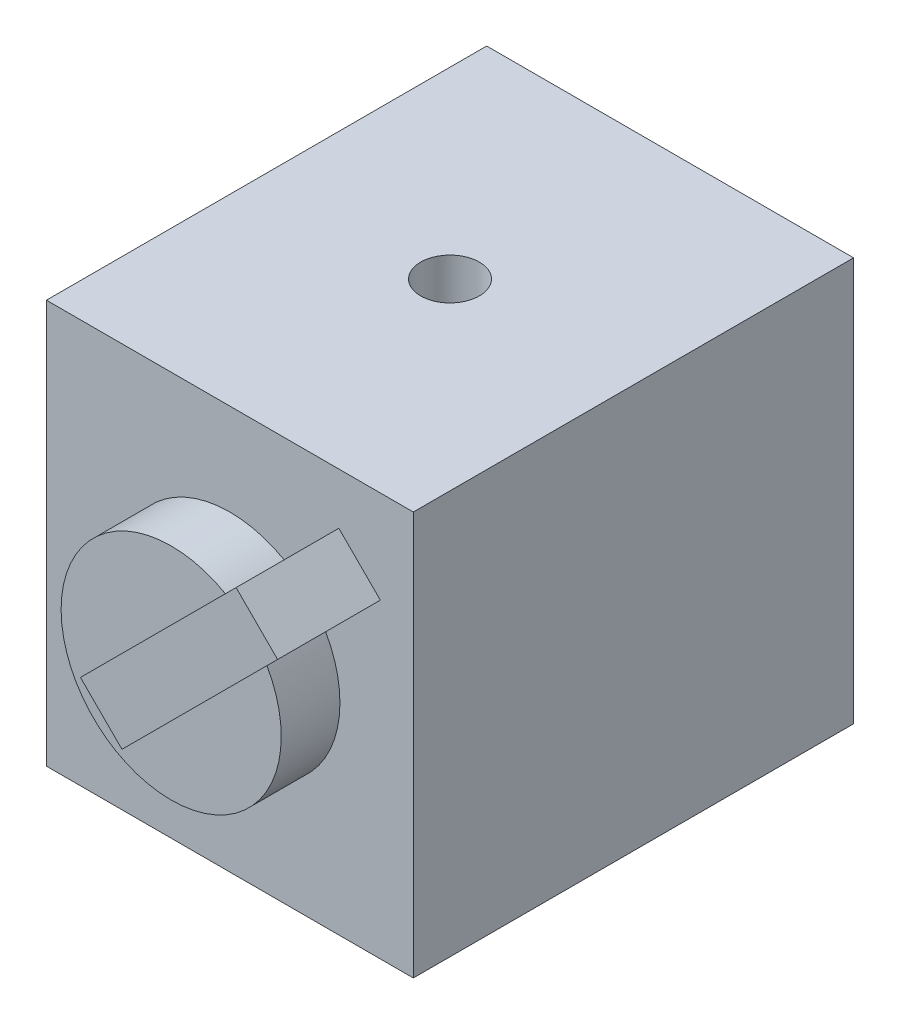
ISO-10303-21;
HEADER;
FILE_DESCRIPTION(('STEP AP214'),'2;1');
FILE_NAME('part.step','',(''),(''),'','','');
FILE_SCHEMA(('AUTOMOTIVE_DESIGN { 1 0 10303 214 1 1 1 1 }'));
ENDSEC;
DATA;
#1=APPLICATION_CONTEXT('core data for automotive mechanical design processes');
#2=APPLICATION_PROTOCOL_DEFINITION('international standard','automotive_design',2000,#1);
#3=PRODUCT_CONTEXT('',#1,'mechanical');
#4=PRODUCT('Part','Part','',(#3));
#5=PRODUCT_RELATED_PRODUCT_CATEGORY('part','',(#4));
#6=PRODUCT_DEFINITION_FORMATION('','',#4);
#7=PRODUCT_DEFINITION_CONTEXT('part definition',#1,'design');
#8=PRODUCT_DEFINITION('design','',#6,#7);
#9=PRODUCT_DEFINITION_SHAPE('','',#8);
#10=(LENGTH_UNIT() NAMED_UNIT(*) SI_UNIT(.MILLI.,.METRE.));
#11=(NAMED_UNIT(*) PLANE_ANGLE_UNIT() SI_UNIT($,.RADIAN.));
#12=(NAMED_UNIT(*) SI_UNIT($,.STERADIAN.) SOLID_ANGLE_UNIT());
#13=UNCERTAINTY_MEASURE_WITH_UNIT(LENGTH_MEASURE(1.E-05),#10,'distance_accuracy_value','');
#14=(GEOMETRIC_REPRESENTATION_CONTEXT(3) GLOBAL_UNCERTAINTY_ASSIGNED_CONTEXT((#13)) GLOBAL_UNIT_ASSIGNED_CONTEXT((#10,
#11,#12)) REPRESENTATION_CONTEXT('',''));
#15=CARTESIAN_POINT('',(0.,0.,0.));
#16=DIRECTION('',(0.,0.,1.));
#17=DIRECTION('',(1.,0.,0.));
#18=AXIS2_PLACEMENT_3D('',#15,#16,#17);
#19=CARTESIAN_POINT('',(-25.,-27.5,30.));
#20=DIRECTION('',(1.,0.,0.));
#21=DIRECTION('',(0.,0.,-1.));
#22=AXIS2_PLACEMENT_3D('',#19,#20,#21);
#23=PLANE('',#22);
#24=DIRECTION('',(0.,-1.,0.));
#25=VECTOR('',#24,1.);
#26=CARTESIAN_POINT('',(-25.,-27.5,-30.));
#27=LINE('',#26,#25);
#28=CARTESIAN_POINT('',(-25.,27.5,-30.));
#29=VERTEX_POINT('',#28);
#30=CARTESIAN_POINT('',(-25.,-27.5,-30.));
#31=VERTEX_POINT('',#30);
#32=EDGE_CURVE('E175',#29,#31,#27,.T.);
#33=ORIENTED_EDGE('',*,*,#32,.T.);
#34=DIRECTION('',(0.,0.,-1.));
#35=VECTOR('',#34,1.);
#36=CARTESIAN_POINT('',(-25.,-27.5,30.));
#37=LINE('',#36,#35);
#38=CARTESIAN_POINT('',(-25.,-27.5,30.));
#39=VERTEX_POINT('',#38);
#40=EDGE_CURVE('E38',#39,#31,#37,.T.);
#41=ORIENTED_EDGE('',*,*,#40,.F.);
#42=DIRECTION('',(0.,-1.,0.));
#43=VECTOR('',#42,1.);
#44=CARTESIAN_POINT('',(-25.,-27.5,30.));
#45=LINE('',#44,#43);
#46=CARTESIAN_POINT('',(-25.,27.5,30.));
#47=VERTEX_POINT('',#46);
#48=EDGE_CURVE('E177',#47,#39,#45,.T.);
#49=ORIENTED_EDGE('',*,*,#48,.F.);
#50=DIRECTION('',(0.,0.,-1.));
#51=VECTOR('',#50,1.);
#52=CARTESIAN_POINT('',(-25.,27.5,30.));
#53=LINE('',#52,#51);
#54=EDGE_CURVE('E183',#47,#29,#53,.T.);
#55=ORIENTED_EDGE('',*,*,#54,.T.);
#56=EDGE_LOOP('',(#33,#41,#49,#55));
#57=FACE_BOUND('',#56,.T.);
#58=ADVANCED_FACE('F35',(#57),#23,.F.);
#59=CARTESIAN_POINT('',(25.,-27.5,30.));
#60=DIRECTION('',(0.,1.,0.));
#61=DIRECTION('',(-1.,0.,0.));
#62=AXIS2_PLACEMENT_3D('',#59,#60,#61);
#63=PLANE('',#62);
#64=DIRECTION('',(1.,0.,0.));
#65=VECTOR('',#64,1.);
#66=CARTESIAN_POINT('',(25.,-27.5,-30.));
#67=LINE('',#66,#65);
#68=CARTESIAN_POINT('',(25.,-27.5,-30.));
#69=VERTEX_POINT('',#68);
#70=EDGE_CURVE('E186',#31,#69,#67,.T.);
#71=ORIENTED_EDGE('',*,*,#70,.T.);
#72=DIRECTION('',(0.,0.,-1.));
#73=VECTOR('',#72,1.);
#74=CARTESIAN_POINT('',(25.,-27.5,30.));
#75=LINE('',#74,#73);
#76=CARTESIAN_POINT('',(25.,-27.5,30.));
#77=VERTEX_POINT('',#76);
#78=EDGE_CURVE('E193',#77,#69,#75,.T.);
#79=ORIENTED_EDGE('',*,*,#78,.F.);
#80=DIRECTION('',(1.,0.,0.));
#81=VECTOR('',#80,1.);
#82=CARTESIAN_POINT('',(25.,-27.5,30.));
#83=LINE('',#82,#81);
#84=EDGE_CURVE('E88',#39,#77,#83,.T.);
#85=ORIENTED_EDGE('',*,*,#84,.F.);
#86=ORIENTED_EDGE('',*,*,#40,.T.);
#87=EDGE_LOOP('',(#71,#79,#85,#86));
#88=FACE_BOUND('',#87,.T.);
#89=ADVANCED_FACE('F199',(#88),#63,.F.);
#90=CARTESIAN_POINT('',(25.,-27.5,30.));
#91=DIRECTION('',(-1.,0.,0.));
#92=DIRECTION('',(0.,0.,1.));
#93=AXIS2_PLACEMENT_3D('',#90,#91,#92);
#94=PLANE('',#93);
#95=DIRECTION('',(0.,1.,0.));
#96=VECTOR('',#95,1.);
#97=CARTESIAN_POINT('',(25.,-27.5,-30.));
#98=LINE('',#97,#96);
#99=CARTESIAN_POINT('',(25.,27.5,-30.));
#100=VERTEX_POINT('',#99);
#101=EDGE_CURVE('E188',#69,#100,#98,.T.);
#102=ORIENTED_EDGE('',*,*,#101,.T.);
#103=DIRECTION('',(0.,0.,-1.));
#104=VECTOR('',#103,1.);
#105=CARTESIAN_POINT('',(25.,27.5,30.));
#106=LINE('',#105,#104);
#107=CARTESIAN_POINT('',(25.,27.5,30.));
#108=VERTEX_POINT('',#107);
#109=EDGE_CURVE('E192',#108,#100,#106,.T.);
#110=ORIENTED_EDGE('',*,*,#109,.F.);
#111=DIRECTION('',(0.,1.,0.));
#112=VECTOR('',#111,1.);
#113=CARTESIAN_POINT('',(25.,-27.5,30.));
#114=LINE('',#113,#112);
#115=EDGE_CURVE('E180',#77,#108,#114,.T.);
#116=ORIENTED_EDGE('',*,*,#115,.F.);
#117=ORIENTED_EDGE('',*,*,#78,.T.);
#118=EDGE_LOOP('',(#102,#110,#116,#117));
#119=FACE_BOUND('',#118,.T.);
#120=ADVANCED_FACE('F206',(#119),#94,.F.);
#121=CARTESIAN_POINT('',(25.,27.5,30.));
#122=DIRECTION('',(0.,-1.,0.));
#123=DIRECTION('',(1.,0.,0.));
#124=AXIS2_PLACEMENT_3D('',#121,#122,#123);
#125=PLANE('',#124);
#126=CARTESIAN_POINT('',(0.,27.5,0.));
#127=DIRECTION('',(0.,1.,0.));
#128=DIRECTION('',(-1.,0.,0.));
#129=AXIS2_PLACEMENT_3D('',#126,#127,#128);
#130=CIRCLE('',#129,4.);
#131=CARTESIAN_POINT('',(-4.,27.5,0.));
#132=VERTEX_POINT('',#131);
#133=EDGE_CURVE('E150',#132,#132,#130,.T.);
#134=ORIENTED_EDGE('',*,*,#133,.F.);
#135=EDGE_LOOP('',(#134));
#136=FACE_BOUND('',#135,.T.);
#137=DIRECTION('',(-1.,0.,0.));
#138=VECTOR('',#137,1.);
#139=CARTESIAN_POINT('',(25.,27.5,-30.));
#140=LINE('',#139,#138);
#141=EDGE_CURVE('E80',#100,#29,#140,.T.);
#142=ORIENTED_EDGE('',*,*,#141,.T.);
#143=ORIENTED_EDGE('',*,*,#54,.F.);
#144=DIRECTION('',(-1.,0.,0.));
#145=VECTOR('',#144,1.);
#146=CARTESIAN_POINT('',(25.,27.5,30.));
#147=LINE('',#146,#145);
#148=EDGE_CURVE('E59',#108,#47,#147,.T.);
#149=ORIENTED_EDGE('',*,*,#148,.F.);
#150=ORIENTED_EDGE('',*,*,#109,.T.);
#151=EDGE_LOOP('',(#142,#143,#149,#150));
#152=FACE_BOUND('',#151,.T.);
#153=ADVANCED_FACE('F207',(#136,#152),#125,.F.);
#154=CARTESIAN_POINT('',(0.,0.,30.));
#155=DIRECTION('',(0.,0.,1.));
#156=DIRECTION('',(1.,0.,0.));
#157=AXIS2_PLACEMENT_3D('',#154,#155,#156);
#158=PLANE('',#157);
#159=DIRECTION('',(-0.707106781186546,-0.707106781186549,0.));
#160=VECTOR('',#159,1.);
#161=CARTESIAN_POINT('',(-0.707106781186544,-6.36396103067892,30.));
#162=LINE('',#161,#160);
#163=CARTESIAN_POINT('',(20.5060966544098,14.8492424049175,30.));
#164=VERTEX_POINT('',#163);
#165=CARTESIAN_POINT('',(13.0509512748766,7.39409702538428,30.));
#166=VERTEX_POINT('',#165);
#167=EDGE_CURVE('E163',#164,#166,#162,.T.);
#168=ORIENTED_EDGE('',*,*,#167,.T.);
#169=CARTESIAN_POINT('',(0.,0.,30.));
#170=DIRECTION('',(0.,0.,1.));
#171=DIRECTION('',(1.,0.,0.));
#172=AXIS2_PLACEMENT_3D('',#169,#170,#171);
#173=CIRCLE('',#172,15.);
#174=CARTESIAN_POINT('',(7.39409702538423,13.0509512748766,30.));
#175=VERTEX_POINT('',#174);
#176=EDGE_CURVE('E11',#175,#166,#173,.T.);
#177=ORIENTED_EDGE('',*,*,#176,.F.);
#178=DIRECTION('',(0.707106781186546,0.707106781186549,0.));
#179=VECTOR('',#178,1.);
#180=CARTESIAN_POINT('',(14.8492424049175,20.5060966544099,30.));
#181=LINE('',#180,#179);
#182=CARTESIAN_POINT('',(14.8492424049175,20.5060966544099,30.));
#183=VERTEX_POINT('',#182);
#184=EDGE_CURVE('E170',#175,#183,#181,.T.);
#185=ORIENTED_EDGE('',*,*,#184,.T.);
#186=DIRECTION('',(0.707106781186549,-0.707106781186546,0.));
#187=VECTOR('',#186,1.);
#188=CARTESIAN_POINT('',(20.5060966544098,14.8492424049175,30.));
#189=LINE('',#188,#187);
#190=EDGE_CURVE('E130',#183,#164,#189,.T.);
#191=ORIENTED_EDGE('',*,*,#190,.T.);
#192=EDGE_LOOP('',(#168,#177,#185,#191));
#193=FACE_BOUND('',#192,.T.);
#194=ORIENTED_EDGE('',*,*,#48,.T.);
#195=ORIENTED_EDGE('',*,*,#84,.T.);
#196=ORIENTED_EDGE('',*,*,#115,.T.);
#197=ORIENTED_EDGE('',*,*,#148,.T.);
#198=EDGE_LOOP('',(#194,#195,#196,#197));
#199=FACE_BOUND('',#198,.T.);
#200=ADVANCED_FACE('F208',(#193,#199),#158,.T.);
#201=CARTESIAN_POINT('',(0.,0.,-30.));
#202=DIRECTION('',(0.,0.,1.));
#203=DIRECTION('',(1.,0.,0.));
#204=AXIS2_PLACEMENT_3D('',#201,#202,#203);
#205=PLANE('',#204);
#206=ORIENTED_EDGE('',*,*,#32,.F.);
#207=ORIENTED_EDGE('',*,*,#141,.F.);
#208=ORIENTED_EDGE('',*,*,#101,.F.);
#209=ORIENTED_EDGE('',*,*,#70,.F.);
#210=EDGE_LOOP('',(#206,#207,#208,#209));
#211=FACE_BOUND('',#210,.T.);
#212=ADVANCED_FACE('F204',(#211),#205,.F.);
#213=CARTESIAN_POINT('',(0.,0.,38.));
#214=DIRECTION('',(0.,0.,-1.));
#215=DIRECTION('',(-1.,0.,0.));
#216=AXIS2_PLACEMENT_3D('',#213,#214,#215);
#217=CYLINDRICAL_SURFACE('',#216,15.);
#218=ORIENTED_EDGE('',*,*,#176,.T.);
#219=DIRECTION('',(0.,0.,-1.));
#220=VECTOR('',#219,1.);
#221=CARTESIAN_POINT('',(13.0509512748766,7.39409702538428,38.));
#222=LINE('',#221,#220);
#223=CARTESIAN_POINT('',(13.0509512748766,7.39409702538428,38.));
#224=VERTEX_POINT('',#223);
#225=EDGE_CURVE('E134',#224,#166,#222,.T.);
#226=ORIENTED_EDGE('',*,*,#225,.F.);
#227=CARTESIAN_POINT('',(0.,0.,38.));
#228=DIRECTION('',(0.,0.,1.));
#229=DIRECTION('',(1.,0.,0.));
#230=AXIS2_PLACEMENT_3D('',#227,#228,#229);
#231=CIRCLE('',#230,15.);
#232=CARTESIAN_POINT('',(7.39409702538422,13.0509512748766,38.));
#233=VERTEX_POINT('',#232);
#234=EDGE_CURVE('E168',#233,#224,#231,.T.);
#235=ORIENTED_EDGE('',*,*,#234,.F.);
#236=DIRECTION('',(0.,0.,-1.));
#237=VECTOR('',#236,1.);
#238=CARTESIAN_POINT('',(7.39409702538422,13.0509512748766,38.));
#239=LINE('',#238,#237);
#240=EDGE_CURVE('E164',#175,#233,#239,.F.);
#241=ORIENTED_EDGE('',*,*,#240,.F.);
#242=EDGE_LOOP('',(#218,#226,#235,#241));
#243=FACE_BOUND('',#242,.T.);
#244=ADVANCED_FACE('F216',(#243),#217,.T.);
#245=CARTESIAN_POINT('',(0.,0.,38.));
#246=DIRECTION('',(0.,0.,1.));
#247=DIRECTION('',(1.,0.,0.));
#248=AXIS2_PLACEMENT_3D('',#245,#246,#247);
#249=PLANE('',#248);
#250=DIRECTION('',(0.707106781186546,0.707106781186549,0.));
#251=VECTOR('',#250,1.);
#252=CARTESIAN_POINT('',(-0.707106781186544,-6.36396103067892,38.));
#253=LINE('',#252,#251);
#254=CARTESIAN_POINT('',(-0.707106781186544,-6.36396103067892,38.));
#255=VERTEX_POINT('',#254);
#256=EDGE_CURVE('E145',#255,#224,#253,.T.);
#257=ORIENTED_EDGE('',*,*,#256,.F.);
#258=DIRECTION('',(0.707106781186549,-0.707106781186546,0.));
#259=VECTOR('',#258,1.);
#260=CARTESIAN_POINT('',(-6.36396103067892,-0.707106781186573,38.));
#261=LINE('',#260,#259);
#262=CARTESIAN_POINT('',(-6.36396103067892,-0.707106781186574,38.));
#263=VERTEX_POINT('',#262);
#264=EDGE_CURVE('E147',#263,#255,#261,.T.);
#265=ORIENTED_EDGE('',*,*,#264,.F.);
#266=DIRECTION('',(-0.707106781186546,-0.707106781186549,0.));
#267=VECTOR('',#266,1.);
#268=CARTESIAN_POINT('',(14.8492424049175,20.5060966544099,38.));
#269=LINE('',#268,#267);
#270=EDGE_CURVE('E156',#233,#263,#269,.T.);
#271=ORIENTED_EDGE('',*,*,#270,.F.);
#272=ORIENTED_EDGE('',*,*,#234,.T.);
#273=EDGE_LOOP('',(#257,#265,#271,#272));
#274=FACE_BOUND('',#273,.T.);
#275=ADVANCED_FACE('F275',(#274),#249,.T.);
#276=CARTESIAN_POINT('',(20.5060966544098,14.8492424049175,-30.002));
#277=DIRECTION('',(0.707106781186546,0.707106781186549,0.));
#278=DIRECTION('',(-0.707106781186549,0.707106781186546,0.));
#279=AXIS2_PLACEMENT_3D('',#276,#277,#278);
#280=PLANE('',#279);
#281=ORIENTED_EDGE('',*,*,#190,.F.);
#282=DIRECTION('',(0.,0.,1.));
#283=VECTOR('',#282,1.);
#284=CARTESIAN_POINT('',(14.8492424049175,20.5060966544099,-30.002));
#285=LINE('',#284,#283);
#286=CARTESIAN_POINT('',(14.8492424049175,20.5060966544099,44.));
#287=VERTEX_POINT('',#286);
#288=EDGE_CURVE('E123',#183,#287,#285,.T.);
#289=ORIENTED_EDGE('',*,*,#288,.T.);
#290=DIRECTION('',(-0.707106781186549,0.707106781186546,0.));
#291=VECTOR('',#290,1.);
#292=CARTESIAN_POINT('',(20.5060966544098,14.8492424049175,44.));
#293=LINE('',#292,#291);
#294=CARTESIAN_POINT('',(20.5060966544098,14.8492424049175,44.));
#295=VERTEX_POINT('',#294);
#296=EDGE_CURVE('E128',#295,#287,#293,.T.);
#297=ORIENTED_EDGE('',*,*,#296,.F.);
#298=DIRECTION('',(0.,0.,1.));
#299=VECTOR('',#298,1.);
#300=CARTESIAN_POINT('',(20.5060966544098,14.8492424049175,-30.002));
#301=LINE('',#300,#299);
#302=EDGE_CURVE('E133',#164,#295,#301,.T.);
#303=ORIENTED_EDGE('',*,*,#302,.F.);
#304=EDGE_LOOP('',(#281,#289,#297,#303));
#305=FACE_BOUND('',#304,.T.);
#306=ADVANCED_FACE('F125',(#305),#280,.T.);
#307=CARTESIAN_POINT('',(-0.707106781186544,-6.36396103067892,-30.002));
#308=DIRECTION('',(0.707106781186549,-0.707106781186546,0.));
#309=DIRECTION('',(0.707106781186546,0.707106781186549,0.));
#310=AXIS2_PLACEMENT_3D('',#307,#308,#309);
#311=PLANE('',#310);
#312=ORIENTED_EDGE('',*,*,#302,.T.);
#313=DIRECTION('',(0.707106781186546,0.707106781186549,0.));
#314=VECTOR('',#313,1.);
#315=CARTESIAN_POINT('',(-0.707106781186544,-6.36396103067892,44.));
#316=LINE('',#315,#314);
#317=CARTESIAN_POINT('',(-0.707106781186544,-6.36396103067892,44.));
#318=VERTEX_POINT('',#317);
#319=EDGE_CURVE('E144',#318,#295,#316,.T.);
#320=ORIENTED_EDGE('',*,*,#319,.F.);
#321=DIRECTION('',(0.,0.,-1.));
#322=VECTOR('',#321,1.);
#323=CARTESIAN_POINT('',(-0.707106781186544,-6.36396103067892,44.));
#324=LINE('',#323,#322);
#325=EDGE_CURVE('E155',#318,#255,#324,.T.);
#326=ORIENTED_EDGE('',*,*,#325,.T.);
#327=ORIENTED_EDGE('',*,*,#256,.T.);
#328=ORIENTED_EDGE('',*,*,#225,.T.);
#329=ORIENTED_EDGE('',*,*,#167,.F.);
#330=EDGE_LOOP('',(#312,#320,#326,#327,#328,#329));
#331=FACE_BOUND('',#330,.T.);
#332=ADVANCED_FACE('F274',(#331),#311,.T.);
#333=CARTESIAN_POINT('',(14.8492424049175,20.5060966544099,-30.002));
#334=DIRECTION('',(-0.707106781186549,0.707106781186546,0.));
#335=DIRECTION('',(-0.707106781186546,-0.707106781186549,0.));
#336=AXIS2_PLACEMENT_3D('',#333,#334,#335);
#337=PLANE('',#336);
#338=ORIENTED_EDGE('',*,*,#184,.F.);
#339=ORIENTED_EDGE('',*,*,#240,.T.);
#340=ORIENTED_EDGE('',*,*,#270,.T.);
#341=DIRECTION('',(0.,0.,-1.));
#342=VECTOR('',#341,1.);
#343=CARTESIAN_POINT('',(-6.36396103067892,-0.707106781186573,44.));
#344=LINE('',#343,#342);
#345=CARTESIAN_POINT('',(-6.36396103067892,-0.707106781186573,44.));
#346=VERTEX_POINT('',#345);
#347=EDGE_CURVE('E50',#346,#263,#344,.T.);
#348=ORIENTED_EDGE('',*,*,#347,.F.);
#349=DIRECTION('',(-0.707106781186546,-0.707106781186549,0.));
#350=VECTOR('',#349,1.);
#351=CARTESIAN_POINT('',(14.8492424049175,20.5060966544099,44.));
#352=LINE('',#351,#350);
#353=EDGE_CURVE('E136',#287,#346,#352,.T.);
#354=ORIENTED_EDGE('',*,*,#353,.F.);
#355=ORIENTED_EDGE('',*,*,#288,.F.);
#356=EDGE_LOOP('',(#338,#339,#340,#348,#354,#355));
#357=FACE_BOUND('',#356,.T.);
#358=ADVANCED_FACE('F137',(#357),#337,.T.);
#359=CARTESIAN_POINT('',(-6.36396103067892,-0.707106781186573,44.));
#360=DIRECTION('',(0.707106781186546,0.707106781186549,0.));
#361=DIRECTION('',(-0.707106781186549,0.707106781186546,0.));
#362=AXIS2_PLACEMENT_3D('',#359,#360,#361);
#363=PLANE('',#362);
#364=ORIENTED_EDGE('',*,*,#264,.T.);
#365=ORIENTED_EDGE('',*,*,#325,.F.);
#366=DIRECTION('',(0.707106781186549,-0.707106781186546,0.));
#367=VECTOR('',#366,1.);
#368=CARTESIAN_POINT('',(-6.36396103067892,-0.707106781186573,44.));
#369=LINE('',#368,#367);
#370=EDGE_CURVE('E139',#346,#318,#369,.T.);
#371=ORIENTED_EDGE('',*,*,#370,.F.);
#372=ORIENTED_EDGE('',*,*,#347,.T.);
#373=EDGE_LOOP('',(#364,#365,#371,#372));
#374=FACE_BOUND('',#373,.T.);
#375=ADVANCED_FACE('F269',(#374),#363,.F.);
#376=CARTESIAN_POINT('',(0.,0.,44.));
#377=DIRECTION('',(0.,0.,1.));
#378=DIRECTION('',(1.,0.,0.));
#379=AXIS2_PLACEMENT_3D('',#376,#377,#378);
#380=PLANE('',#379);
#381=ORIENTED_EDGE('',*,*,#296,.T.);
#382=ORIENTED_EDGE('',*,*,#353,.T.);
#383=ORIENTED_EDGE('',*,*,#370,.T.);
#384=ORIENTED_EDGE('',*,*,#319,.T.);
#385=EDGE_LOOP('',(#381,#382,#383,#384));
#386=FACE_BOUND('',#385,.T.);
#387=ADVANCED_FACE('F142',(#386),#380,.T.);
#388=CARTESIAN_POINT('',(0.,21.5,0.));
#389=DIRECTION('',(0.,1.,0.));
#390=DIRECTION('',(-1.,0.,0.));
#391=AXIS2_PLACEMENT_3D('',#388,#389,#390);
#392=CYLINDRICAL_SURFACE('',#391,4.);
#393=CARTESIAN_POINT('',(0.,21.5,0.));
#394=DIRECTION('',(0.,1.,0.));
#395=DIRECTION('',(-1.,0.,0.));
#396=AXIS2_PLACEMENT_3D('',#393,#394,#395);
#397=CIRCLE('',#396,4.);
#398=CARTESIAN_POINT('',(-4.,21.5,0.));
#399=VERTEX_POINT('',#398);
#400=EDGE_CURVE('E158',#399,#399,#397,.T.);
#401=ORIENTED_EDGE('',*,*,#400,.F.);
#402=EDGE_LOOP('',(#401));
#403=FACE_BOUND('',#402,.T.);
#404=ORIENTED_EDGE('',*,*,#133,.T.);
#405=EDGE_LOOP('',(#404));
#406=FACE_BOUND('',#405,.T.);
#407=ADVANCED_FACE('F247',(#403,#406),#392,.F.);
#408=CARTESIAN_POINT('',(0.,21.5,0.));
#409=DIRECTION('',(0.,1.,0.));
#410=DIRECTION('',(-1.,0.,0.));
#411=AXIS2_PLACEMENT_3D('',#408,#409,#410);
#412=PLANE('',#411);
#413=ORIENTED_EDGE('',*,*,#400,.T.);
#414=EDGE_LOOP('',(#413));
#415=FACE_BOUND('',#414,.T.);
#416=ADVANCED_FACE('F252',(#415),#412,.T.);
#417=CLOSED_SHELL('',(#58,#89,#120,#153,#200,#212,#244,#275,#306,#332,#358,#375,#387,#407,#416));
#418=MANIFOLD_SOLID_BREP('B2',#417);
#419=ADVANCED_BREP_SHAPE_REPRESENTATION('',(#18,#418),#14);
#420=SHAPE_DEFINITION_REPRESENTATION(#9,#419);
ENDSEC;
END-ISO-10303-21;
